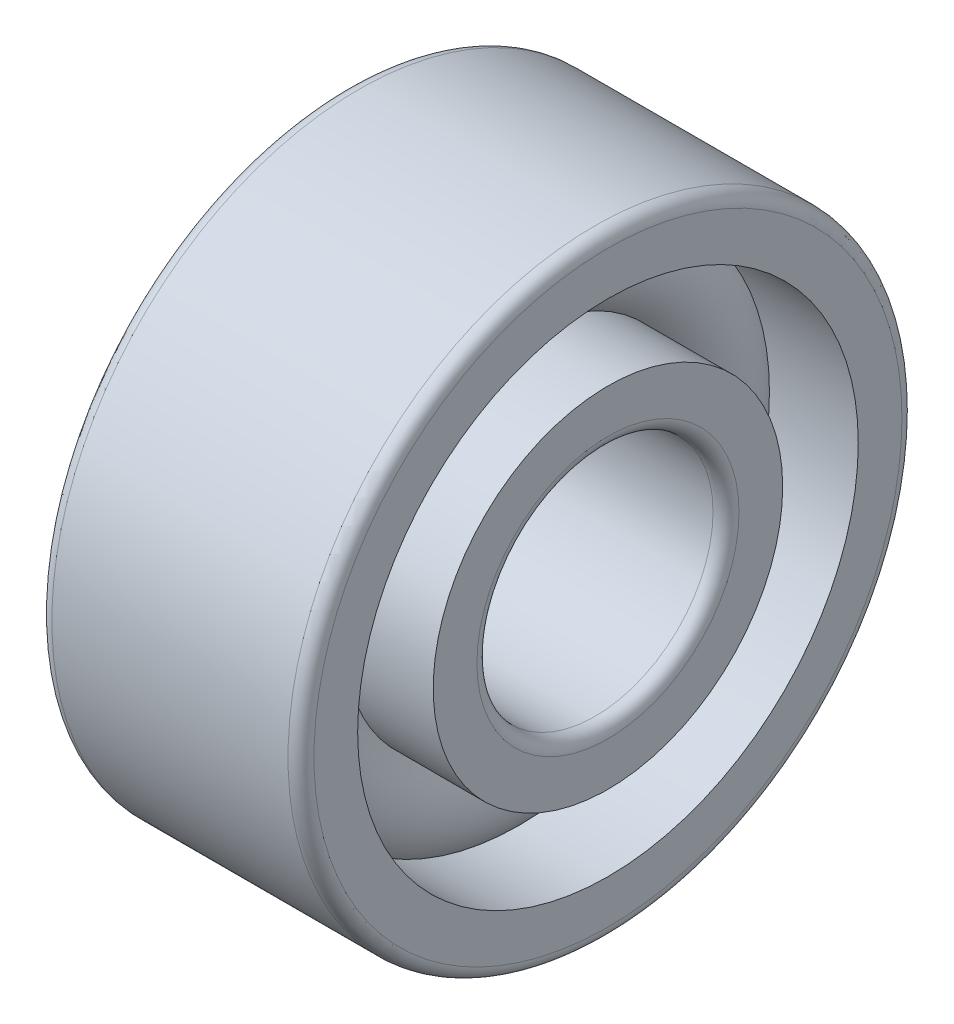
ISO-10303-21;
HEADER;
FILE_DESCRIPTION(('STEP AP214'),'2;1');
FILE_NAME('part.step','',(''),(''),'','','');
FILE_SCHEMA(('AUTOMOTIVE_DESIGN { 1 0 10303 214 1 1 1 1 }'));
ENDSEC;
DATA;
#1=APPLICATION_CONTEXT('core data for automotive mechanical design processes');
#2=APPLICATION_PROTOCOL_DEFINITION('international standard','automotive_design',2000,#1);
#3=PRODUCT_CONTEXT('',#1,'mechanical');
#4=PRODUCT('Part','Part','',(#3));
#5=PRODUCT_RELATED_PRODUCT_CATEGORY('part','',(#4));
#6=PRODUCT_DEFINITION_FORMATION('','',#4);
#7=PRODUCT_DEFINITION_CONTEXT('part definition',#1,'design');
#8=PRODUCT_DEFINITION('design','',#6,#7);
#9=PRODUCT_DEFINITION_SHAPE('','',#8);
#10=(LENGTH_UNIT() NAMED_UNIT(*) SI_UNIT(.MILLI.,.METRE.));
#11=(NAMED_UNIT(*) PLANE_ANGLE_UNIT() SI_UNIT($,.RADIAN.));
#12=(NAMED_UNIT(*) SI_UNIT($,.STERADIAN.) SOLID_ANGLE_UNIT());
#13=UNCERTAINTY_MEASURE_WITH_UNIT(LENGTH_MEASURE(1.E-05),#10,'distance_accuracy_value','');
#14=(GEOMETRIC_REPRESENTATION_CONTEXT(3) GLOBAL_UNCERTAINTY_ASSIGNED_CONTEXT((#13)) GLOBAL_UNIT_ASSIGNED_CONTEXT((#10,
#11,#12)) REPRESENTATION_CONTEXT('',''));
#15=CARTESIAN_POINT('',(0.,0.,0.));
#16=DIRECTION('',(0.,0.,1.));
#17=DIRECTION('',(1.,0.,0.));
#18=AXIS2_PLACEMENT_3D('',#15,#16,#17);
#19=CARTESIAN_POINT('',(0.,0.,0.));
#20=DIRECTION('',(-1.,0.,0.));
#21=DIRECTION('',(0.,0.,1.));
#22=AXIS2_PLACEMENT_3D('',#19,#20,#21);
#23=TOROIDAL_SURFACE('',#22,18.,4.8);
#24=CARTESIAN_POINT('',(3.57770876399966,0.,0.));
#25=DIRECTION('',(-1.,0.,0.));
#26=DIRECTION('',(0.,0.,1.));
#27=AXIS2_PLACEMENT_3D('',#24,#25,#26);
#28=CIRCLE('',#27,21.2);
#29=CARTESIAN_POINT('',(3.57770876399966,0.,21.2));
#30=VERTEX_POINT('',#29);
#31=EDGE_CURVE('E36',#30,#30,#28,.F.);
#32=ORIENTED_EDGE('',*,*,#31,.T.);
#33=EDGE_LOOP('',(#32));
#34=FACE_BOUND('',#33,.T.);
#35=CARTESIAN_POINT('',(3.57770876399966,0.,0.));
#36=DIRECTION('',(-1.,0.,0.));
#37=DIRECTION('',(0.,0.,1.));
#38=AXIS2_PLACEMENT_3D('',#35,#36,#37);
#39=CIRCLE('',#38,14.8);
#40=CARTESIAN_POINT('',(3.57770876399966,0.,14.8));
#41=VERTEX_POINT('',#40);
#42=EDGE_CURVE('E10',#41,#41,#39,.T.);
#43=ORIENTED_EDGE('',*,*,#42,.T.);
#44=EDGE_LOOP('',(#43));
#45=FACE_BOUND('',#44,.T.);
#46=ADVANCED_FACE('F32',(#34,#45),#23,.T.);
#47=CARTESIAN_POINT('',(-20.6375,0.,0.));
#48=DIRECTION('',(1.,0.,0.));
#49=DIRECTION('',(0.,0.,-1.));
#50=AXIS2_PLACEMENT_3D('',#47,#48,#49);
#51=CYLINDRICAL_SURFACE('',#50,14.8);
#52=CARTESIAN_POINT('',(11.1,0.,0.));
#53=DIRECTION('',(1.,0.,0.));
#54=DIRECTION('',(0.,0.,-1.));
#55=AXIS2_PLACEMENT_3D('',#52,#53,#54);
#56=CIRCLE('',#55,14.8);
#57=CARTESIAN_POINT('',(11.1,0.,-14.8));
#58=VERTEX_POINT('',#57);
#59=EDGE_CURVE('E45',#58,#58,#56,.T.);
#60=ORIENTED_EDGE('',*,*,#59,.F.);
#61=EDGE_LOOP('',(#60));
#62=FACE_BOUND('',#61,.T.);
#63=ORIENTED_EDGE('',*,*,#42,.F.);
#64=EDGE_LOOP('',(#63));
#65=FACE_BOUND('',#64,.T.);
#66=ADVANCED_FACE('F84',(#62,#65),#51,.T.);
#67=CARTESIAN_POINT('',(-20.6375,0.,0.));
#68=DIRECTION('',(1.,0.,0.));
#69=DIRECTION('',(0.,0.,-1.));
#70=AXIS2_PLACEMENT_3D('',#67,#68,#69);
#71=CYLINDRICAL_SURFACE('',#70,14.8);
#72=CARTESIAN_POINT('',(-11.1,0.,0.));
#73=DIRECTION('',(1.,0.,0.));
#74=DIRECTION('',(0.,0.,-1.));
#75=AXIS2_PLACEMENT_3D('',#72,#73,#74);
#76=CIRCLE('',#75,14.8);
#77=CARTESIAN_POINT('',(-11.1,0.,-14.8));
#78=VERTEX_POINT('',#77);
#79=EDGE_CURVE('E54',#78,#78,#76,.T.);
#80=ORIENTED_EDGE('',*,*,#79,.T.);
#81=EDGE_LOOP('',(#80));
#82=FACE_BOUND('',#81,.T.);
#83=CARTESIAN_POINT('',(-3.57770876399966,0.,0.));
#84=DIRECTION('',(1.,0.,0.));
#85=DIRECTION('',(0.,0.,-1.));
#86=AXIS2_PLACEMENT_3D('',#83,#84,#85);
#87=CIRCLE('',#86,14.8);
#88=CARTESIAN_POINT('',(-3.57770876399966,0.,-14.8));
#89=VERTEX_POINT('',#88);
#90=EDGE_CURVE('E40',#89,#89,#87,.T.);
#91=ORIENTED_EDGE('',*,*,#90,.F.);
#92=EDGE_LOOP('',(#91));
#93=FACE_BOUND('',#92,.T.);
#94=ADVANCED_FACE('F87',(#82,#93),#71,.T.);
#95=CARTESIAN_POINT('',(11.1,11.1,0.));
#96=DIRECTION('',(1.,0.,0.));
#97=DIRECTION('',(0.,0.,-1.));
#98=AXIS2_PLACEMENT_3D('',#95,#96,#97);
#99=PLANE('',#98);
#100=ORIENTED_EDGE('',*,*,#59,.T.);
#101=EDGE_LOOP('',(#100));
#102=FACE_BOUND('',#101,.T.);
#103=CARTESIAN_POINT('',(11.1,0.,0.));
#104=DIRECTION('',(1.,0.,0.));
#105=DIRECTION('',(0.,0.,-1.));
#106=AXIS2_PLACEMENT_3D('',#103,#104,#105);
#107=CIRCLE('',#106,11.1);
#108=CARTESIAN_POINT('',(11.1,0.,-11.1));
#109=VERTEX_POINT('',#108);
#110=EDGE_CURVE('E76',#109,#109,#107,.T.);
#111=ORIENTED_EDGE('',*,*,#110,.F.);
#112=EDGE_LOOP('',(#111));
#113=FACE_BOUND('',#112,.T.);
#114=ADVANCED_FACE('F81',(#102,#113),#99,.T.);
#115=CARTESIAN_POINT('',(10.,0.,0.));
#116=DIRECTION('',(1.,0.,0.));
#117=DIRECTION('',(0.,0.,-1.));
#118=AXIS2_PLACEMENT_3D('',#115,#116,#117);
#119=TOROIDAL_SURFACE('',#118,11.1,1.1);
#120=ORIENTED_EDGE('',*,*,#110,.T.);
#121=EDGE_LOOP('',(#120));
#122=FACE_BOUND('',#121,.T.);
#123=CARTESIAN_POINT('',(10.,0.,0.));
#124=DIRECTION('',(1.,0.,0.));
#125=DIRECTION('',(0.,0.,-1.));
#126=AXIS2_PLACEMENT_3D('',#123,#124,#125);
#127=CIRCLE('',#126,9.99999999999999);
#128=CARTESIAN_POINT('',(10.,0.,-9.99999999999999));
#129=VERTEX_POINT('',#128);
#130=EDGE_CURVE('E73',#129,#129,#127,.T.);
#131=ORIENTED_EDGE('',*,*,#130,.F.);
#132=EDGE_LOOP('',(#131));
#133=FACE_BOUND('',#132,.T.);
#134=ADVANCED_FACE('F98',(#122,#133),#119,.T.);
#135=CARTESIAN_POINT('',(-20.6375,0.,0.));
#136=DIRECTION('',(1.,0.,0.));
#137=DIRECTION('',(0.,0.,-1.));
#138=AXIS2_PLACEMENT_3D('',#135,#136,#137);
#139=CYLINDRICAL_SURFACE('',#138,10.);
#140=ORIENTED_EDGE('',*,*,#130,.T.);
#141=EDGE_LOOP('',(#140));
#142=FACE_BOUND('',#141,.T.);
#143=CARTESIAN_POINT('',(-10.,0.,0.));
#144=DIRECTION('',(1.,0.,0.));
#145=DIRECTION('',(0.,0.,-1.));
#146=AXIS2_PLACEMENT_3D('',#143,#144,#145);
#147=CIRCLE('',#146,10.);
#148=CARTESIAN_POINT('',(-10.,0.,-10.));
#149=VERTEX_POINT('',#148);
#150=EDGE_CURVE('E70',#149,#149,#147,.T.);
#151=ORIENTED_EDGE('',*,*,#150,.F.);
#152=EDGE_LOOP('',(#151));
#153=FACE_BOUND('',#152,.T.);
#154=ADVANCED_FACE('F101',(#142,#153),#139,.F.);
#155=CARTESIAN_POINT('',(-10.,0.,0.));
#156=DIRECTION('',(1.,0.,0.));
#157=DIRECTION('',(0.,0.,-1.));
#158=AXIS2_PLACEMENT_3D('',#155,#156,#157);
#159=TOROIDAL_SURFACE('',#158,11.1,1.1);
#160=ORIENTED_EDGE('',*,*,#150,.T.);
#161=EDGE_LOOP('',(#160));
#162=FACE_BOUND('',#161,.T.);
#163=CARTESIAN_POINT('',(-11.1,0.,0.));
#164=DIRECTION('',(1.,0.,0.));
#165=DIRECTION('',(0.,0.,-1.));
#166=AXIS2_PLACEMENT_3D('',#163,#164,#165);
#167=CIRCLE('',#166,11.1);
#168=CARTESIAN_POINT('',(-11.1,0.,-11.1));
#169=VERTEX_POINT('',#168);
#170=EDGE_CURVE('E67',#169,#169,#167,.T.);
#171=ORIENTED_EDGE('',*,*,#170,.F.);
#172=EDGE_LOOP('',(#171));
#173=FACE_BOUND('',#172,.T.);
#174=ADVANCED_FACE('F105',(#162,#173),#159,.T.);
#175=CARTESIAN_POINT('',(-11.1,14.8,0.));
#176=DIRECTION('',(-1.,0.,0.));
#177=DIRECTION('',(0.,0.,1.));
#178=AXIS2_PLACEMENT_3D('',#175,#176,#177);
#179=PLANE('',#178);
#180=ORIENTED_EDGE('',*,*,#170,.T.);
#181=EDGE_LOOP('',(#180));
#182=FACE_BOUND('',#181,.T.);
#183=ORIENTED_EDGE('',*,*,#79,.F.);
#184=EDGE_LOOP('',(#183));
#185=FACE_BOUND('',#184,.T.);
#186=ADVANCED_FACE('F109',(#182,#185),#179,.T.);
#187=CARTESIAN_POINT('',(-3.57770876399966,0.,0.));
#188=DIRECTION('',(1.,0.,0.));
#189=DIRECTION('',(0.,0.,-1.));
#190=AXIS2_PLACEMENT_3D('',#187,#188,#189);
#191=CIRCLE('',#190,21.2);
#192=CARTESIAN_POINT('',(-3.57770876399966,0.,-21.2));
#193=VERTEX_POINT('',#192);
#194=EDGE_CURVE('E48',#193,#193,#191,.F.);
#195=ORIENTED_EDGE('',*,*,#194,.T.);
#196=EDGE_LOOP('',(#195));
#197=FACE_BOUND('',#196,.T.);
#198=ORIENTED_EDGE('',*,*,#90,.T.);
#199=EDGE_LOOP('',(#198));
#200=FACE_BOUND('',#199,.T.);
#201=ADVANCED_FACE('F34',(#197,#200),#23,.T.);
#202=CARTESIAN_POINT('',(-20.6375,0.,0.));
#203=DIRECTION('',(1.,0.,0.));
#204=DIRECTION('',(0.,0.,-1.));
#205=AXIS2_PLACEMENT_3D('',#202,#203,#204);
#206=CYLINDRICAL_SURFACE('',#205,21.2);
#207=CARTESIAN_POINT('',(11.1,0.,0.));
#208=DIRECTION('',(1.,0.,0.));
#209=DIRECTION('',(0.,0.,-1.));
#210=AXIS2_PLACEMENT_3D('',#207,#208,#209);
#211=CIRCLE('',#210,21.2);
#212=CARTESIAN_POINT('',(11.1,0.,-21.2));
#213=VERTEX_POINT('',#212);
#214=EDGE_CURVE('E50',#213,#213,#211,.T.);
#215=ORIENTED_EDGE('',*,*,#214,.T.);
#216=EDGE_LOOP('',(#215));
#217=FACE_BOUND('',#216,.T.);
#218=ORIENTED_EDGE('',*,*,#31,.F.);
#219=EDGE_LOOP('',(#218));
#220=FACE_BOUND('',#219,.T.);
#221=ADVANCED_FACE('F114',(#217,#220),#206,.F.);
#222=CARTESIAN_POINT('',(-20.6375,0.,0.));
#223=DIRECTION('',(1.,0.,0.));
#224=DIRECTION('',(0.,0.,-1.));
#225=AXIS2_PLACEMENT_3D('',#222,#223,#224);
#226=CYLINDRICAL_SURFACE('',#225,21.2);
#227=CARTESIAN_POINT('',(-11.1,0.,0.));
#228=DIRECTION('',(1.,0.,0.));
#229=DIRECTION('',(0.,0.,-1.));
#230=AXIS2_PLACEMENT_3D('',#227,#228,#229);
#231=CIRCLE('',#230,21.2);
#232=CARTESIAN_POINT('',(-11.1,0.,-21.2));
#233=VERTEX_POINT('',#232);
#234=EDGE_CURVE('E145',#233,#233,#231,.T.);
#235=ORIENTED_EDGE('',*,*,#234,.F.);
#236=EDGE_LOOP('',(#235));
#237=FACE_BOUND('',#236,.T.);
#238=ORIENTED_EDGE('',*,*,#194,.F.);
#239=EDGE_LOOP('',(#238));
#240=FACE_BOUND('',#239,.T.);
#241=ADVANCED_FACE('F117',(#237,#240),#226,.F.);
#242=CARTESIAN_POINT('',(11.1,24.9,0.));
#243=DIRECTION('',(1.,0.,0.));
#244=DIRECTION('',(0.,0.,-1.));
#245=AXIS2_PLACEMENT_3D('',#242,#243,#244);
#246=PLANE('',#245);
#247=CARTESIAN_POINT('',(11.1,0.,0.));
#248=DIRECTION('',(1.,0.,0.));
#249=DIRECTION('',(0.,0.,-1.));
#250=AXIS2_PLACEMENT_3D('',#247,#248,#249);
#251=CIRCLE('',#250,24.9);
#252=CARTESIAN_POINT('',(11.1,0.,-24.9));
#253=VERTEX_POINT('',#252);
#254=EDGE_CURVE('E56',#253,#253,#251,.T.);
#255=ORIENTED_EDGE('',*,*,#254,.T.);
#256=EDGE_LOOP('',(#255));
#257=FACE_BOUND('',#256,.T.);
#258=ORIENTED_EDGE('',*,*,#214,.F.);
#259=EDGE_LOOP('',(#258));
#260=FACE_BOUND('',#259,.T.);
#261=ADVANCED_FACE('F118',(#257,#260),#246,.T.);
#262=CARTESIAN_POINT('',(10.,0.,0.));
#263=DIRECTION('',(1.,0.,0.));
#264=DIRECTION('',(0.,0.,-1.));
#265=AXIS2_PLACEMENT_3D('',#262,#263,#264);
#266=TOROIDAL_SURFACE('',#265,24.9,1.1);
#267=CARTESIAN_POINT('',(10.,0.,0.));
#268=DIRECTION('',(1.,0.,0.));
#269=DIRECTION('',(0.,0.,-1.));
#270=AXIS2_PLACEMENT_3D('',#267,#268,#269);
#271=CIRCLE('',#270,26.);
#272=CARTESIAN_POINT('',(10.,0.,-26.));
#273=VERTEX_POINT('',#272);
#274=EDGE_CURVE('E61',#273,#273,#271,.T.);
#275=ORIENTED_EDGE('',*,*,#274,.T.);
#276=EDGE_LOOP('',(#275));
#277=FACE_BOUND('',#276,.T.);
#278=ORIENTED_EDGE('',*,*,#254,.F.);
#279=EDGE_LOOP('',(#278));
#280=FACE_BOUND('',#279,.T.);
#281=ADVANCED_FACE('F121',(#277,#280),#266,.T.);
#282=CARTESIAN_POINT('',(-20.6375,0.,0.));
#283=DIRECTION('',(1.,0.,0.));
#284=DIRECTION('',(0.,0.,-1.));
#285=AXIS2_PLACEMENT_3D('',#282,#283,#284);
#286=CYLINDRICAL_SURFACE('',#285,26.);
#287=CARTESIAN_POINT('',(-10.,0.,0.));
#288=DIRECTION('',(1.,0.,0.));
#289=DIRECTION('',(0.,0.,-1.));
#290=AXIS2_PLACEMENT_3D('',#287,#288,#289);
#291=CIRCLE('',#290,26.);
#292=CARTESIAN_POINT('',(-10.,0.,-26.));
#293=VERTEX_POINT('',#292);
#294=EDGE_CURVE('E149',#293,#293,#291,.T.);
#295=ORIENTED_EDGE('',*,*,#294,.T.);
#296=EDGE_LOOP('',(#295));
#297=FACE_BOUND('',#296,.T.);
#298=ORIENTED_EDGE('',*,*,#274,.F.);
#299=EDGE_LOOP('',(#298));
#300=FACE_BOUND('',#299,.T.);
#301=ADVANCED_FACE('F125',(#297,#300),#286,.T.);
#302=CARTESIAN_POINT('',(-10.,0.,0.));
#303=DIRECTION('',(1.,0.,0.));
#304=DIRECTION('',(0.,0.,-1.));
#305=AXIS2_PLACEMENT_3D('',#302,#303,#304);
#306=TOROIDAL_SURFACE('',#305,24.9,1.1);
#307=CARTESIAN_POINT('',(-11.1,0.,0.));
#308=DIRECTION('',(1.,0.,0.));
#309=DIRECTION('',(0.,0.,-1.));
#310=AXIS2_PLACEMENT_3D('',#307,#308,#309);
#311=CIRCLE('',#310,24.9);
#312=CARTESIAN_POINT('',(-11.1,0.,-24.9));
#313=VERTEX_POINT('',#312);
#314=EDGE_CURVE('E146',#313,#313,#311,.T.);
#315=ORIENTED_EDGE('',*,*,#314,.T.);
#316=EDGE_LOOP('',(#315));
#317=FACE_BOUND('',#316,.T.);
#318=ORIENTED_EDGE('',*,*,#294,.F.);
#319=EDGE_LOOP('',(#318));
#320=FACE_BOUND('',#319,.T.);
#321=ADVANCED_FACE('F129',(#317,#320),#306,.T.);
#322=CARTESIAN_POINT('',(-11.1,21.2,0.));
#323=DIRECTION('',(-1.,0.,0.));
#324=DIRECTION('',(0.,0.,1.));
#325=AXIS2_PLACEMENT_3D('',#322,#323,#324);
#326=PLANE('',#325);
#327=ORIENTED_EDGE('',*,*,#234,.T.);
#328=EDGE_LOOP('',(#327));
#329=FACE_BOUND('',#328,.T.);
#330=ORIENTED_EDGE('',*,*,#314,.F.);
#331=EDGE_LOOP('',(#330));
#332=FACE_BOUND('',#331,.T.);
#333=ADVANCED_FACE('F133',(#329,#332),#326,.T.);
#334=CLOSED_SHELL('',(#46,#66,#94,#114,#134,#154,#174,#186,#201,#221,#241,#261,#281,#301,#321,#333));
#335=MANIFOLD_SOLID_BREP('B2',#334);
#336=ADVANCED_BREP_SHAPE_REPRESENTATION('',(#18,#335),#14);
#337=SHAPE_DEFINITION_REPRESENTATION(#9,#336);
ENDSEC;
END-ISO-10303-21;
